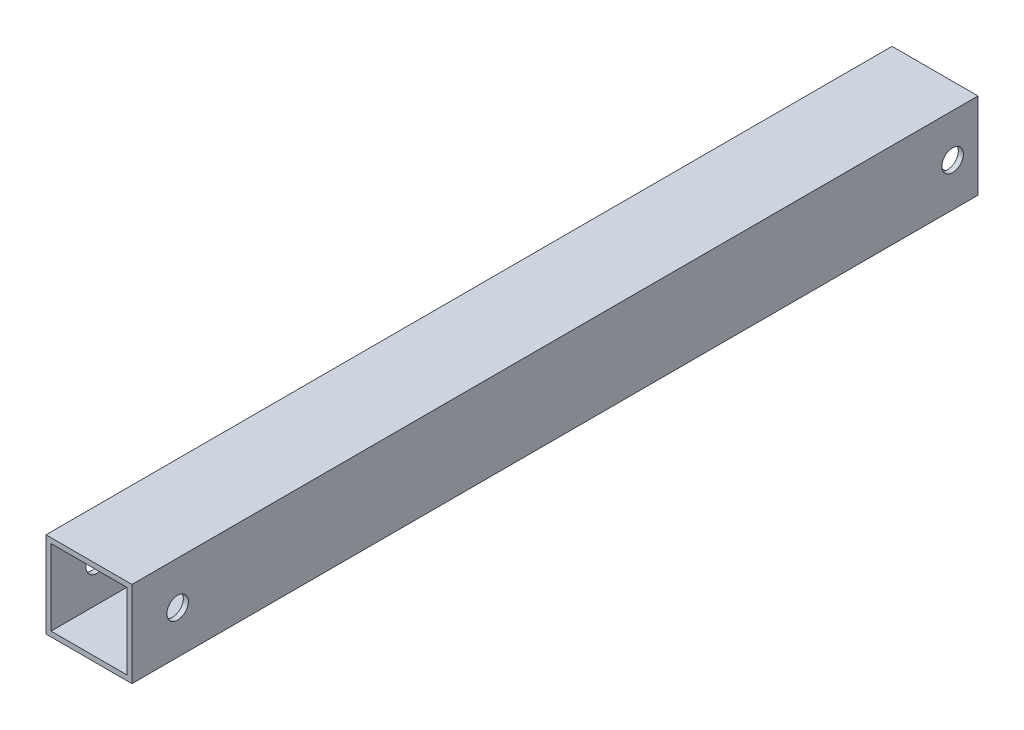
ISO-10303-21;
HEADER;
FILE_DESCRIPTION(('STEP AP214'),'2;1');
FILE_NAME('part.step','',(''),(''),'','','');
FILE_SCHEMA(('AUTOMOTIVE_DESIGN { 1 0 10303 214 1 1 1 1 }'));
ENDSEC;
DATA;
#1=APPLICATION_CONTEXT('core data for automotive mechanical design processes');
#2=APPLICATION_PROTOCOL_DEFINITION('international standard','automotive_design',2000,#1);
#3=PRODUCT_CONTEXT('',#1,'mechanical');
#4=PRODUCT('Part','Part','',(#3));
#5=PRODUCT_RELATED_PRODUCT_CATEGORY('part','',(#4));
#6=PRODUCT_DEFINITION_FORMATION('','',#4);
#7=PRODUCT_DEFINITION_CONTEXT('part definition',#1,'design');
#8=PRODUCT_DEFINITION('design','',#6,#7);
#9=PRODUCT_DEFINITION_SHAPE('','',#8);
#10=(LENGTH_UNIT() NAMED_UNIT(*) SI_UNIT(.MILLI.,.METRE.));
#11=(NAMED_UNIT(*) PLANE_ANGLE_UNIT() SI_UNIT($,.RADIAN.));
#12=(NAMED_UNIT(*) SI_UNIT($,.STERADIAN.) SOLID_ANGLE_UNIT());
#13=UNCERTAINTY_MEASURE_WITH_UNIT(LENGTH_MEASURE(1.E-05),#10,'distance_accuracy_value','');
#14=(GEOMETRIC_REPRESENTATION_CONTEXT(3) GLOBAL_UNCERTAINTY_ASSIGNED_CONTEXT((#13)) GLOBAL_UNIT_ASSIGNED_CONTEXT((#10,
#11,#12)) REPRESENTATION_CONTEXT('',''));
#15=CARTESIAN_POINT('',(0.,0.,0.));
#16=DIRECTION('',(0.,0.,1.));
#17=DIRECTION('',(1.,0.,0.));
#18=AXIS2_PLACEMENT_3D('',#15,#16,#17);
#19=CARTESIAN_POINT('',(0.,0.,250.));
#20=DIRECTION('',(0.,0.,-1.));
#21=DIRECTION('',(-1.,0.,0.));
#22=AXIS2_PLACEMENT_3D('',#19,#20,#21);
#23=PLANE('',#22);
#24=DIRECTION('',(0.,1.,0.));
#25=VECTOR('',#24,1.);
#26=CARTESIAN_POINT('',(25.4,-25.4,250.));
#27=LINE('',#26,#25);
#28=CARTESIAN_POINT('',(25.4,-25.4,250.));
#29=VERTEX_POINT('',#28);
#30=CARTESIAN_POINT('',(25.4,25.4,250.));
#31=VERTEX_POINT('',#30);
#32=EDGE_CURVE('E157',#29,#31,#27,.T.);
#33=ORIENTED_EDGE('',*,*,#32,.T.);
#34=DIRECTION('',(-1.,0.,0.));
#35=VECTOR('',#34,1.);
#36=CARTESIAN_POINT('',(-25.4,25.4,250.));
#37=LINE('',#36,#35);
#38=CARTESIAN_POINT('',(-25.4,25.4,250.));
#39=VERTEX_POINT('',#38);
#40=EDGE_CURVE('E161',#31,#39,#37,.T.);
#41=ORIENTED_EDGE('',*,*,#40,.T.);
#42=DIRECTION('',(0.,-1.,0.));
#43=VECTOR('',#42,1.);
#44=CARTESIAN_POINT('',(-25.4,-25.4,250.));
#45=LINE('',#44,#43);
#46=CARTESIAN_POINT('',(-25.4,-25.4,250.));
#47=VERTEX_POINT('',#46);
#48=EDGE_CURVE('E165',#39,#47,#45,.T.);
#49=ORIENTED_EDGE('',*,*,#48,.T.);
#50=DIRECTION('',(1.,0.,0.));
#51=VECTOR('',#50,1.);
#52=CARTESIAN_POINT('',(-25.4,-25.4,250.));
#53=LINE('',#52,#51);
#54=EDGE_CURVE('E168',#47,#29,#53,.T.);
#55=ORIENTED_EDGE('',*,*,#54,.T.);
#56=EDGE_LOOP('',(#33,#41,#49,#55));
#57=FACE_BOUND('',#56,.T.);
#58=DIRECTION('',(0.,-1.,0.));
#59=VECTOR('',#58,1.);
#60=CARTESIAN_POINT('',(-22.4,-22.4,250.));
#61=LINE('',#60,#59);
#62=CARTESIAN_POINT('',(-22.4,22.4,250.));
#63=VERTEX_POINT('',#62);
#64=CARTESIAN_POINT('',(-22.4,-22.4,250.));
#65=VERTEX_POINT('',#64);
#66=EDGE_CURVE('E107',#63,#65,#61,.T.);
#67=ORIENTED_EDGE('',*,*,#66,.F.);
#68=DIRECTION('',(-1.,0.,0.));
#69=VECTOR('',#68,1.);
#70=CARTESIAN_POINT('',(-22.4,22.4,250.));
#71=LINE('',#70,#69);
#72=CARTESIAN_POINT('',(22.4,22.4,250.));
#73=VERTEX_POINT('',#72);
#74=EDGE_CURVE('E133',#73,#63,#71,.T.);
#75=ORIENTED_EDGE('',*,*,#74,.F.);
#76=DIRECTION('',(0.,1.,0.));
#77=VECTOR('',#76,1.);
#78=CARTESIAN_POINT('',(22.4,-22.4,250.));
#79=LINE('',#78,#77);
#80=CARTESIAN_POINT('',(22.4,-22.4,250.));
#81=VERTEX_POINT('',#80);
#82=EDGE_CURVE('E129',#81,#73,#79,.T.);
#83=ORIENTED_EDGE('',*,*,#82,.F.);
#84=DIRECTION('',(1.,0.,0.));
#85=VECTOR('',#84,1.);
#86=CARTESIAN_POINT('',(-22.4,-22.4,250.));
#87=LINE('',#86,#85);
#88=EDGE_CURVE('E116',#65,#81,#87,.T.);
#89=ORIENTED_EDGE('',*,*,#88,.F.);
#90=EDGE_LOOP('',(#67,#75,#83,#89));
#91=FACE_BOUND('',#90,.T.);
#92=ADVANCED_FACE('F39',(#57,#91),#23,.F.);
#93=CARTESIAN_POINT('',(0.,0.,-250.));
#94=DIRECTION('',(0.,0.,-1.));
#95=DIRECTION('',(-1.,0.,0.));
#96=AXIS2_PLACEMENT_3D('',#93,#94,#95);
#97=PLANE('',#96);
#98=DIRECTION('',(0.,1.,0.));
#99=VECTOR('',#98,1.);
#100=CARTESIAN_POINT('',(25.4,-25.4,-250.));
#101=LINE('',#100,#99);
#102=CARTESIAN_POINT('',(25.4,-25.4,-250.));
#103=VERTEX_POINT('',#102);
#104=CARTESIAN_POINT('',(25.4,25.4,-250.));
#105=VERTEX_POINT('',#104);
#106=EDGE_CURVE('E125',#103,#105,#101,.T.);
#107=ORIENTED_EDGE('',*,*,#106,.F.);
#108=DIRECTION('',(1.,0.,0.));
#109=VECTOR('',#108,1.);
#110=CARTESIAN_POINT('',(-25.4,-25.4,-250.));
#111=LINE('',#110,#109);
#112=CARTESIAN_POINT('',(-25.4,-25.4,-250.));
#113=VERTEX_POINT('',#112);
#114=EDGE_CURVE('E162',#113,#103,#111,.T.);
#115=ORIENTED_EDGE('',*,*,#114,.F.);
#116=DIRECTION('',(0.,-1.,0.));
#117=VECTOR('',#116,1.);
#118=CARTESIAN_POINT('',(-25.4,-25.4,-250.));
#119=LINE('',#118,#117);
#120=CARTESIAN_POINT('',(-25.4,25.4,-250.));
#121=VERTEX_POINT('',#120);
#122=EDGE_CURVE('E178',#121,#113,#119,.T.);
#123=ORIENTED_EDGE('',*,*,#122,.F.);
#124=DIRECTION('',(-1.,0.,0.));
#125=VECTOR('',#124,1.);
#126=CARTESIAN_POINT('',(-25.4,25.4,-250.));
#127=LINE('',#126,#125);
#128=EDGE_CURVE('E175',#105,#121,#127,.T.);
#129=ORIENTED_EDGE('',*,*,#128,.F.);
#130=EDGE_LOOP('',(#107,#115,#123,#129));
#131=FACE_BOUND('',#130,.T.);
#132=DIRECTION('',(-1.,0.,0.));
#133=VECTOR('',#132,1.);
#134=CARTESIAN_POINT('',(-22.4,22.4,-250.));
#135=LINE('',#134,#133);
#136=CARTESIAN_POINT('',(22.4,22.4,-250.));
#137=VERTEX_POINT('',#136);
#138=CARTESIAN_POINT('',(-22.4,22.4,-250.));
#139=VERTEX_POINT('',#138);
#140=EDGE_CURVE('E117',#137,#139,#135,.T.);
#141=ORIENTED_EDGE('',*,*,#140,.T.);
#142=DIRECTION('',(0.,-1.,0.));
#143=VECTOR('',#142,1.);
#144=CARTESIAN_POINT('',(-22.4,-22.4,-250.));
#145=LINE('',#144,#143);
#146=CARTESIAN_POINT('',(-22.4,-22.4,-250.));
#147=VERTEX_POINT('',#146);
#148=EDGE_CURVE('E65',#139,#147,#145,.T.);
#149=ORIENTED_EDGE('',*,*,#148,.T.);
#150=DIRECTION('',(1.,0.,0.));
#151=VECTOR('',#150,1.);
#152=CARTESIAN_POINT('',(-22.4,-22.4,-250.));
#153=LINE('',#152,#151);
#154=CARTESIAN_POINT('',(22.4,-22.4,-250.));
#155=VERTEX_POINT('',#154);
#156=EDGE_CURVE('E123',#147,#155,#153,.T.);
#157=ORIENTED_EDGE('',*,*,#156,.T.);
#158=DIRECTION('',(0.,1.,0.));
#159=VECTOR('',#158,1.);
#160=CARTESIAN_POINT('',(22.4,-22.4,-250.));
#161=LINE('',#160,#159);
#162=EDGE_CURVE('E144',#155,#137,#161,.T.);
#163=ORIENTED_EDGE('',*,*,#162,.T.);
#164=EDGE_LOOP('',(#141,#149,#157,#163));
#165=FACE_BOUND('',#164,.T.);
#166=ADVANCED_FACE('F238',(#131,#165),#97,.T.);
#167=CARTESIAN_POINT('',(25.4,-25.4,250.));
#168=DIRECTION('',(-1.,0.,0.));
#169=DIRECTION('',(0.,0.,1.));
#170=AXIS2_PLACEMENT_3D('',#167,#168,#169);
#171=PLANE('',#170);
#172=CARTESIAN_POINT('',(25.4,0.,223.));
#173=DIRECTION('',(1.,0.,0.));
#174=DIRECTION('',(0.,0.,-1.));
#175=AXIS2_PLACEMENT_3D('',#172,#173,#174);
#176=CIRCLE('',#175,6.35);
#177=CARTESIAN_POINT('',(25.4,0.,216.65));
#178=VERTEX_POINT('',#177);
#179=EDGE_CURVE('E204',#178,#178,#176,.T.);
#180=ORIENTED_EDGE('',*,*,#179,.F.);
#181=EDGE_LOOP('',(#180));
#182=FACE_BOUND('',#181,.T.);
#183=CARTESIAN_POINT('',(25.4,0.,-235.));
#184=DIRECTION('',(1.,0.,0.));
#185=DIRECTION('',(0.,0.,1.));
#186=AXIS2_PLACEMENT_3D('',#183,#184,#185);
#187=CIRCLE('',#186,6.35);
#188=CARTESIAN_POINT('',(25.4,0.,-228.65));
#189=VERTEX_POINT('',#188);
#190=EDGE_CURVE('E216',#189,#189,#187,.T.);
#191=ORIENTED_EDGE('',*,*,#190,.F.);
#192=EDGE_LOOP('',(#191));
#193=FACE_BOUND('',#192,.T.);
#194=ORIENTED_EDGE('',*,*,#106,.T.);
#195=DIRECTION('',(0.,0.,-1.));
#196=VECTOR('',#195,1.);
#197=CARTESIAN_POINT('',(25.4,25.4,250.));
#198=LINE('',#197,#196);
#199=EDGE_CURVE('E11',#31,#105,#198,.T.);
#200=ORIENTED_EDGE('',*,*,#199,.F.);
#201=ORIENTED_EDGE('',*,*,#32,.F.);
#202=DIRECTION('',(0.,0.,-1.));
#203=VECTOR('',#202,1.);
#204=CARTESIAN_POINT('',(25.4,-25.4,250.));
#205=LINE('',#204,#203);
#206=EDGE_CURVE('E171',#29,#103,#205,.T.);
#207=ORIENTED_EDGE('',*,*,#206,.T.);
#208=EDGE_LOOP('',(#194,#200,#201,#207));
#209=FACE_BOUND('',#208,.T.);
#210=ADVANCED_FACE('F41',(#182,#193,#209),#171,.F.);
#211=CARTESIAN_POINT('',(-25.4,25.4,250.));
#212=DIRECTION('',(0.,-1.,0.));
#213=DIRECTION('',(0.,0.,-1.));
#214=AXIS2_PLACEMENT_3D('',#211,#212,#213);
#215=PLANE('',#214);
#216=ORIENTED_EDGE('',*,*,#128,.T.);
#217=DIRECTION('',(0.,0.,-1.));
#218=VECTOR('',#217,1.);
#219=CARTESIAN_POINT('',(-25.4,25.4,250.));
#220=LINE('',#219,#218);
#221=EDGE_CURVE('E49',#39,#121,#220,.T.);
#222=ORIENTED_EDGE('',*,*,#221,.F.);
#223=ORIENTED_EDGE('',*,*,#40,.F.);
#224=ORIENTED_EDGE('',*,*,#199,.T.);
#225=EDGE_LOOP('',(#216,#222,#223,#224));
#226=FACE_BOUND('',#225,.T.);
#227=ADVANCED_FACE('F264',(#226),#215,.F.);
#228=CARTESIAN_POINT('',(-25.4,-25.4,250.));
#229=DIRECTION('',(1.,0.,0.));
#230=DIRECTION('',(0.,0.,-1.));
#231=AXIS2_PLACEMENT_3D('',#228,#229,#230);
#232=PLANE('',#231);
#233=CARTESIAN_POINT('',(-25.4,0.,223.));
#234=DIRECTION('',(1.,0.,0.));
#235=DIRECTION('',(0.,0.,-1.));
#236=AXIS2_PLACEMENT_3D('',#233,#234,#235);
#237=CIRCLE('',#236,6.35);
#238=CARTESIAN_POINT('',(-25.4,0.,216.65));
#239=VERTEX_POINT('',#238);
#240=EDGE_CURVE('E196',#239,#239,#237,.T.);
#241=ORIENTED_EDGE('',*,*,#240,.T.);
#242=EDGE_LOOP('',(#241));
#243=FACE_BOUND('',#242,.T.);
#244=CARTESIAN_POINT('',(-25.4,0.,-235.));
#245=DIRECTION('',(1.,0.,0.));
#246=DIRECTION('',(0.,0.,1.));
#247=AXIS2_PLACEMENT_3D('',#244,#245,#246);
#248=CIRCLE('',#247,6.35);
#249=CARTESIAN_POINT('',(-25.4,0.,-228.65));
#250=VERTEX_POINT('',#249);
#251=EDGE_CURVE('E210',#250,#250,#248,.T.);
#252=ORIENTED_EDGE('',*,*,#251,.T.);
#253=EDGE_LOOP('',(#252));
#254=FACE_BOUND('',#253,.T.);
#255=ORIENTED_EDGE('',*,*,#122,.T.);
#256=DIRECTION('',(0.,0.,-1.));
#257=VECTOR('',#256,1.);
#258=CARTESIAN_POINT('',(-25.4,-25.4,250.));
#259=LINE('',#258,#257);
#260=EDGE_CURVE('E186',#47,#113,#259,.T.);
#261=ORIENTED_EDGE('',*,*,#260,.F.);
#262=ORIENTED_EDGE('',*,*,#48,.F.);
#263=ORIENTED_EDGE('',*,*,#221,.T.);
#264=EDGE_LOOP('',(#255,#261,#262,#263));
#265=FACE_BOUND('',#264,.T.);
#266=ADVANCED_FACE('F261',(#243,#254,#265),#232,.F.);
#267=CARTESIAN_POINT('',(-25.4,-25.4,250.));
#268=DIRECTION('',(0.,1.,0.));
#269=DIRECTION('',(0.,0.,1.));
#270=AXIS2_PLACEMENT_3D('',#267,#268,#269);
#271=PLANE('',#270);
#272=ORIENTED_EDGE('',*,*,#114,.T.);
#273=ORIENTED_EDGE('',*,*,#206,.F.);
#274=ORIENTED_EDGE('',*,*,#54,.F.);
#275=ORIENTED_EDGE('',*,*,#260,.T.);
#276=EDGE_LOOP('',(#272,#273,#274,#275));
#277=FACE_BOUND('',#276,.T.);
#278=ADVANCED_FACE('F258',(#277),#271,.F.);
#279=CARTESIAN_POINT('',(-22.4,-22.4,250.));
#280=DIRECTION('',(1.,0.,0.));
#281=DIRECTION('',(0.,0.,-1.));
#282=AXIS2_PLACEMENT_3D('',#279,#280,#281);
#283=PLANE('',#282);
#284=CARTESIAN_POINT('',(-22.4,0.,223.));
#285=DIRECTION('',(1.,0.,0.));
#286=DIRECTION('',(0.,0.,-1.));
#287=AXIS2_PLACEMENT_3D('',#284,#285,#286);
#288=CIRCLE('',#287,6.35);
#289=CARTESIAN_POINT('',(-22.4,0.,216.65));
#290=VERTEX_POINT('',#289);
#291=EDGE_CURVE('E141',#290,#290,#288,.T.);
#292=ORIENTED_EDGE('',*,*,#291,.F.);
#293=EDGE_LOOP('',(#292));
#294=FACE_BOUND('',#293,.T.);
#295=CARTESIAN_POINT('',(-22.4,0.,-235.));
#296=DIRECTION('',(1.,0.,0.));
#297=DIRECTION('',(0.,0.,-1.));
#298=AXIS2_PLACEMENT_3D('',#295,#296,#297);
#299=CIRCLE('',#298,6.35);
#300=CARTESIAN_POINT('',(-22.4,0.,-241.35));
#301=VERTEX_POINT('',#300);
#302=EDGE_CURVE('E195',#301,#301,#299,.T.);
#303=ORIENTED_EDGE('',*,*,#302,.F.);
#304=EDGE_LOOP('',(#303));
#305=FACE_BOUND('',#304,.T.);
#306=ORIENTED_EDGE('',*,*,#148,.F.);
#307=DIRECTION('',(0.,0.,-1.));
#308=VECTOR('',#307,1.);
#309=CARTESIAN_POINT('',(-22.4,22.4,250.));
#310=LINE('',#309,#308);
#311=EDGE_CURVE('E111',#63,#139,#310,.T.);
#312=ORIENTED_EDGE('',*,*,#311,.F.);
#313=ORIENTED_EDGE('',*,*,#66,.T.);
#314=DIRECTION('',(0.,0.,-1.));
#315=VECTOR('',#314,1.);
#316=CARTESIAN_POINT('',(-22.4,-22.4,250.));
#317=LINE('',#316,#315);
#318=EDGE_CURVE('E110',#65,#147,#317,.T.);
#319=ORIENTED_EDGE('',*,*,#318,.T.);
#320=EDGE_LOOP('',(#306,#312,#313,#319));
#321=FACE_BOUND('',#320,.T.);
#322=ADVANCED_FACE('F109',(#294,#305,#321),#283,.T.);
#323=CARTESIAN_POINT('',(-22.4,-22.4,250.));
#324=DIRECTION('',(0.,1.,0.));
#325=DIRECTION('',(0.,0.,1.));
#326=AXIS2_PLACEMENT_3D('',#323,#324,#325);
#327=PLANE('',#326);
#328=ORIENTED_EDGE('',*,*,#156,.F.);
#329=ORIENTED_EDGE('',*,*,#318,.F.);
#330=ORIENTED_EDGE('',*,*,#88,.T.);
#331=DIRECTION('',(0.,0.,-1.));
#332=VECTOR('',#331,1.);
#333=CARTESIAN_POINT('',(22.4,-22.4,250.));
#334=LINE('',#333,#332);
#335=EDGE_CURVE('E126',#81,#155,#334,.T.);
#336=ORIENTED_EDGE('',*,*,#335,.T.);
#337=EDGE_LOOP('',(#328,#329,#330,#336));
#338=FACE_BOUND('',#337,.T.);
#339=ADVANCED_FACE('F120',(#338),#327,.T.);
#340=CARTESIAN_POINT('',(22.4,-22.4,250.));
#341=DIRECTION('',(-1.,0.,0.));
#342=DIRECTION('',(0.,-1.,0.));
#343=AXIS2_PLACEMENT_3D('',#340,#341,#342);
#344=PLANE('',#343);
#345=CARTESIAN_POINT('',(22.4,0.,223.));
#346=DIRECTION('',(-1.,0.,0.));
#347=DIRECTION('',(0.,-1.,0.));
#348=AXIS2_PLACEMENT_3D('',#345,#346,#347);
#349=CIRCLE('',#348,6.35);
#350=CARTESIAN_POINT('',(22.4,-6.35,223.));
#351=VERTEX_POINT('',#350);
#352=EDGE_CURVE('E43',#351,#351,#349,.T.);
#353=ORIENTED_EDGE('',*,*,#352,.F.);
#354=EDGE_LOOP('',(#353));
#355=FACE_BOUND('',#354,.T.);
#356=CARTESIAN_POINT('',(22.4,0.,-235.));
#357=DIRECTION('',(-1.,0.,0.));
#358=DIRECTION('',(0.,-1.,0.));
#359=AXIS2_PLACEMENT_3D('',#356,#357,#358);
#360=CIRCLE('',#359,6.35);
#361=CARTESIAN_POINT('',(22.4,-6.35,-235.));
#362=VERTEX_POINT('',#361);
#363=EDGE_CURVE('E192',#362,#362,#360,.T.);
#364=ORIENTED_EDGE('',*,*,#363,.F.);
#365=EDGE_LOOP('',(#364));
#366=FACE_BOUND('',#365,.T.);
#367=ORIENTED_EDGE('',*,*,#162,.F.);
#368=ORIENTED_EDGE('',*,*,#335,.F.);
#369=ORIENTED_EDGE('',*,*,#82,.T.);
#370=DIRECTION('',(0.,0.,-1.));
#371=VECTOR('',#370,1.);
#372=CARTESIAN_POINT('',(22.4,22.4,250.));
#373=LINE('',#372,#371);
#374=EDGE_CURVE('E57',#73,#137,#373,.T.);
#375=ORIENTED_EDGE('',*,*,#374,.T.);
#376=EDGE_LOOP('',(#367,#368,#369,#375));
#377=FACE_BOUND('',#376,.T.);
#378=ADVANCED_FACE('F230',(#355,#366,#377),#344,.T.);
#379=CARTESIAN_POINT('',(-22.4,22.4,250.));
#380=DIRECTION('',(0.,-1.,0.));
#381=DIRECTION('',(1.,0.,0.));
#382=AXIS2_PLACEMENT_3D('',#379,#380,#381);
#383=PLANE('',#382);
#384=ORIENTED_EDGE('',*,*,#140,.F.);
#385=ORIENTED_EDGE('',*,*,#374,.F.);
#386=ORIENTED_EDGE('',*,*,#74,.T.);
#387=ORIENTED_EDGE('',*,*,#311,.T.);
#388=EDGE_LOOP('',(#384,#385,#386,#387));
#389=FACE_BOUND('',#388,.T.);
#390=ADVANCED_FACE('F233',(#389),#383,.T.);
#391=CARTESIAN_POINT('',(-25.4,0.,-235.));
#392=DIRECTION('',(1.,0.,0.));
#393=DIRECTION('',(0.,0.,-1.));
#394=AXIS2_PLACEMENT_3D('',#391,#392,#393);
#395=CYLINDRICAL_SURFACE('',#394,6.35);
#396=ORIENTED_EDGE('',*,*,#363,.T.);
#397=EDGE_LOOP('',(#396));
#398=FACE_BOUND('',#397,.T.);
#399=ORIENTED_EDGE('',*,*,#190,.T.);
#400=EDGE_LOOP('',(#399));
#401=FACE_BOUND('',#400,.T.);
#402=ADVANCED_FACE('F240',(#398,#401),#395,.F.);
#403=CARTESIAN_POINT('',(-25.4,0.,223.));
#404=DIRECTION('',(1.,0.,0.));
#405=DIRECTION('',(0.,0.,-1.));
#406=AXIS2_PLACEMENT_3D('',#403,#404,#405);
#407=CYLINDRICAL_SURFACE('',#406,6.35);
#408=ORIENTED_EDGE('',*,*,#352,.T.);
#409=EDGE_LOOP('',(#408));
#410=FACE_BOUND('',#409,.T.);
#411=ORIENTED_EDGE('',*,*,#179,.T.);
#412=EDGE_LOOP('',(#411));
#413=FACE_BOUND('',#412,.T.);
#414=ADVANCED_FACE('F227',(#410,#413),#407,.F.);
#415=ORIENTED_EDGE('',*,*,#302,.T.);
#416=EDGE_LOOP('',(#415));
#417=FACE_BOUND('',#416,.T.);
#418=ORIENTED_EDGE('',*,*,#251,.F.);
#419=EDGE_LOOP('',(#418));
#420=FACE_BOUND('',#419,.T.);
#421=ADVANCED_FACE('F246',(#417,#420),#395,.F.);
#422=ORIENTED_EDGE('',*,*,#291,.T.);
#423=EDGE_LOOP('',(#422));
#424=FACE_BOUND('',#423,.T.);
#425=ORIENTED_EDGE('',*,*,#240,.F.);
#426=EDGE_LOOP('',(#425));
#427=FACE_BOUND('',#426,.T.);
#428=ADVANCED_FACE('F291',(#424,#427),#407,.F.);
#429=CLOSED_SHELL('',(#92,#166,#210,#227,#266,#278,#322,#339,#378,#390,#402,#414,#421,#428));
#430=MANIFOLD_SOLID_BREP('B2',#429);
#431=ADVANCED_BREP_SHAPE_REPRESENTATION('',(#18,#430),#14);
#432=SHAPE_DEFINITION_REPRESENTATION(#9,#431);
ENDSEC;
END-ISO-10303-21;
